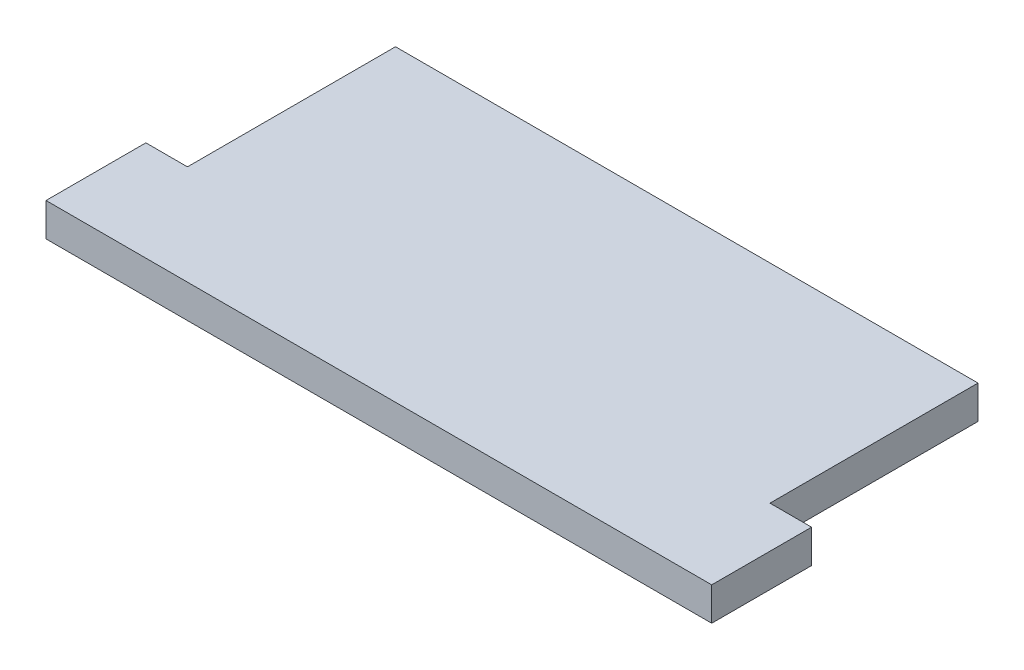
ISO-10303-21;
HEADER;
FILE_DESCRIPTION(('STEP AP214'),'2;1');
FILE_NAME('part.step','',(''),(''),'','','');
FILE_SCHEMA(('AUTOMOTIVE_DESIGN { 1 0 10303 214 1 1 1 1 }'));
ENDSEC;
DATA;
#1=APPLICATION_CONTEXT('core data for automotive mechanical design processes');
#2=APPLICATION_PROTOCOL_DEFINITION('international standard','automotive_design',2000,#1);
#3=PRODUCT_CONTEXT('',#1,'mechanical');
#4=PRODUCT('Part','Part','',(#3));
#5=PRODUCT_RELATED_PRODUCT_CATEGORY('part','',(#4));
#6=PRODUCT_DEFINITION_FORMATION('','',#4);
#7=PRODUCT_DEFINITION_CONTEXT('part definition',#1,'design');
#8=PRODUCT_DEFINITION('design','',#6,#7);
#9=PRODUCT_DEFINITION_SHAPE('','',#8);
#10=(LENGTH_UNIT() NAMED_UNIT(*) SI_UNIT(.MILLI.,.METRE.));
#11=(NAMED_UNIT(*) PLANE_ANGLE_UNIT() SI_UNIT($,.RADIAN.));
#12=(NAMED_UNIT(*) SI_UNIT($,.STERADIAN.) SOLID_ANGLE_UNIT());
#13=UNCERTAINTY_MEASURE_WITH_UNIT(LENGTH_MEASURE(1.E-05),#10,'distance_accuracy_value','');
#14=(GEOMETRIC_REPRESENTATION_CONTEXT(3) GLOBAL_UNCERTAINTY_ASSIGNED_CONTEXT((#13)) GLOBAL_UNIT_ASSIGNED_CONTEXT((#10,
#11,#12)) REPRESENTATION_CONTEXT('',''));
#15=CARTESIAN_POINT('',(0.,0.,0.));
#16=DIRECTION('',(0.,0.,1.));
#17=DIRECTION('',(1.,0.,0.));
#18=AXIS2_PLACEMENT_3D('',#15,#16,#17);
#19=CARTESIAN_POINT('',(0.,2.,-6.));
#20=DIRECTION('',(1.,0.,0.));
#21=DIRECTION('',(0.,0.,-1.));
#22=AXIS2_PLACEMENT_3D('',#19,#20,#21);
#23=PLANE('',#22);
#24=DIRECTION('',(0.,0.,1.));
#25=VECTOR('',#24,1.);
#26=CARTESIAN_POINT('',(0.,0.,-6.));
#27=LINE('',#26,#25);
#28=CARTESIAN_POINT('',(0.,0.,-6.));
#29=VERTEX_POINT('',#28);
#30=CARTESIAN_POINT('',(0.,0.,0.));
#31=VERTEX_POINT('',#30);
#32=EDGE_CURVE('E129',#29,#31,#27,.T.);
#33=ORIENTED_EDGE('',*,*,#32,.T.);
#34=DIRECTION('',(0.,-1.,0.));
#35=VECTOR('',#34,1.);
#36=CARTESIAN_POINT('',(0.,2.,0.));
#37=LINE('',#36,#35);
#38=CARTESIAN_POINT('',(0.,2.,0.));
#39=VERTEX_POINT('',#38);
#40=EDGE_CURVE('E11',#39,#31,#37,.T.);
#41=ORIENTED_EDGE('',*,*,#40,.F.);
#42=DIRECTION('',(0.,0.,1.));
#43=VECTOR('',#42,1.);
#44=CARTESIAN_POINT('',(0.,2.,-6.));
#45=LINE('',#44,#43);
#46=CARTESIAN_POINT('',(0.,2.,-6.));
#47=VERTEX_POINT('',#46);
#48=EDGE_CURVE('E143',#47,#39,#45,.T.);
#49=ORIENTED_EDGE('',*,*,#48,.F.);
#50=DIRECTION('',(0.,-1.,0.));
#51=VECTOR('',#50,1.);
#52=CARTESIAN_POINT('',(0.,2.,-6.));
#53=LINE('',#52,#51);
#54=EDGE_CURVE('E125',#47,#29,#53,.T.);
#55=ORIENTED_EDGE('',*,*,#54,.T.);
#56=EDGE_LOOP('',(#33,#41,#49,#55));
#57=FACE_BOUND('',#56,.T.);
#58=ADVANCED_FACE('F33',(#57),#23,.F.);
#59=CARTESIAN_POINT('',(0.,2.,0.));
#60=DIRECTION('',(0.,0.,-1.));
#61=DIRECTION('',(-1.,0.,0.));
#62=AXIS2_PLACEMENT_3D('',#59,#60,#61);
#63=PLANE('',#62);
#64=DIRECTION('',(1.,0.,0.));
#65=VECTOR('',#64,1.);
#66=CARTESIAN_POINT('',(0.,0.,0.));
#67=LINE('',#66,#65);
#68=CARTESIAN_POINT('',(40.,0.,0.));
#69=VERTEX_POINT('',#68);
#70=EDGE_CURVE('E132',#31,#69,#67,.T.);
#71=ORIENTED_EDGE('',*,*,#70,.T.);
#72=DIRECTION('',(0.,-1.,0.));
#73=VECTOR('',#72,1.);
#74=CARTESIAN_POINT('',(40.,2.,0.));
#75=LINE('',#74,#73);
#76=CARTESIAN_POINT('',(40.,2.,0.));
#77=VERTEX_POINT('',#76);
#78=EDGE_CURVE('E41',#77,#69,#75,.T.);
#79=ORIENTED_EDGE('',*,*,#78,.F.);
#80=DIRECTION('',(1.,0.,0.));
#81=VECTOR('',#80,1.);
#82=CARTESIAN_POINT('',(0.,2.,0.));
#83=LINE('',#82,#81);
#84=EDGE_CURVE('E92',#39,#77,#83,.T.);
#85=ORIENTED_EDGE('',*,*,#84,.F.);
#86=ORIENTED_EDGE('',*,*,#40,.T.);
#87=EDGE_LOOP('',(#71,#79,#85,#86));
#88=FACE_BOUND('',#87,.T.);
#89=ADVANCED_FACE('F178',(#88),#63,.F.);
#90=CARTESIAN_POINT('',(40.,2.,0.));
#91=DIRECTION('',(-1.,0.,0.));
#92=DIRECTION('',(0.,0.,1.));
#93=AXIS2_PLACEMENT_3D('',#90,#91,#92);
#94=PLANE('',#93);
#95=DIRECTION('',(0.,0.,-1.));
#96=VECTOR('',#95,1.);
#97=CARTESIAN_POINT('',(40.,0.,0.));
#98=LINE('',#97,#96);
#99=CARTESIAN_POINT('',(40.,0.,-6.));
#100=VERTEX_POINT('',#99);
#101=EDGE_CURVE('E134',#69,#100,#98,.T.);
#102=ORIENTED_EDGE('',*,*,#101,.T.);
#103=DIRECTION('',(0.,-1.,0.));
#104=VECTOR('',#103,1.);
#105=CARTESIAN_POINT('',(40.,2.,-6.));
#106=LINE('',#105,#104);
#107=CARTESIAN_POINT('',(40.,2.,-6.));
#108=VERTEX_POINT('',#107);
#109=EDGE_CURVE('E150',#108,#100,#106,.T.);
#110=ORIENTED_EDGE('',*,*,#109,.F.);
#111=DIRECTION('',(0.,0.,-1.));
#112=VECTOR('',#111,1.);
#113=CARTESIAN_POINT('',(40.,2.,0.));
#114=LINE('',#113,#112);
#115=EDGE_CURVE('E158',#77,#108,#114,.T.);
#116=ORIENTED_EDGE('',*,*,#115,.F.);
#117=ORIENTED_EDGE('',*,*,#78,.T.);
#118=EDGE_LOOP('',(#102,#110,#116,#117));
#119=FACE_BOUND('',#118,.T.);
#120=ADVANCED_FACE('F156',(#119),#94,.F.);
#121=CARTESIAN_POINT('',(40.,2.,-6.));
#122=DIRECTION('',(0.,0.,1.));
#123=DIRECTION('',(1.,0.,0.));
#124=AXIS2_PLACEMENT_3D('',#121,#122,#123);
#125=PLANE('',#124);
#126=DIRECTION('',(-1.,0.,0.));
#127=VECTOR('',#126,1.);
#128=CARTESIAN_POINT('',(40.,0.,-6.));
#129=LINE('',#128,#127);
#130=CARTESIAN_POINT('',(37.5,0.,-6.));
#131=VERTEX_POINT('',#130);
#132=EDGE_CURVE('E136',#100,#131,#129,.T.);
#133=ORIENTED_EDGE('',*,*,#132,.T.);
#134=DIRECTION('',(0.,-1.,0.));
#135=VECTOR('',#134,1.);
#136=CARTESIAN_POINT('',(37.5,2.,-6.));
#137=LINE('',#136,#135);
#138=CARTESIAN_POINT('',(37.5,2.,-6.));
#139=VERTEX_POINT('',#138);
#140=EDGE_CURVE('E147',#139,#131,#137,.T.);
#141=ORIENTED_EDGE('',*,*,#140,.F.);
#142=DIRECTION('',(-1.,0.,0.));
#143=VECTOR('',#142,1.);
#144=CARTESIAN_POINT('',(40.,2.,-6.));
#145=LINE('',#144,#143);
#146=EDGE_CURVE('E170',#108,#139,#145,.T.);
#147=ORIENTED_EDGE('',*,*,#146,.F.);
#148=ORIENTED_EDGE('',*,*,#109,.T.);
#149=EDGE_LOOP('',(#133,#141,#147,#148));
#150=FACE_BOUND('',#149,.T.);
#151=ADVANCED_FACE('F166',(#150),#125,.F.);
#152=CARTESIAN_POINT('',(37.5,2.,-6.));
#153=DIRECTION('',(-1.,0.,0.));
#154=DIRECTION('',(0.,0.,1.));
#155=AXIS2_PLACEMENT_3D('',#152,#153,#154);
#156=PLANE('',#155);
#157=DIRECTION('',(0.,0.,-1.));
#158=VECTOR('',#157,1.);
#159=CARTESIAN_POINT('',(37.5,0.,-6.));
#160=LINE('',#159,#158);
#161=CARTESIAN_POINT('',(37.5,0.,-18.5));
#162=VERTEX_POINT('',#161);
#163=EDGE_CURVE('E138',#131,#162,#160,.T.);
#164=ORIENTED_EDGE('',*,*,#163,.T.);
#165=DIRECTION('',(0.,-1.,0.));
#166=VECTOR('',#165,1.);
#167=CARTESIAN_POINT('',(37.5,2.,-18.5));
#168=LINE('',#167,#166);
#169=CARTESIAN_POINT('',(37.5,2.,-18.5));
#170=VERTEX_POINT('',#169);
#171=EDGE_CURVE('E120',#170,#162,#168,.T.);
#172=ORIENTED_EDGE('',*,*,#171,.F.);
#173=DIRECTION('',(0.,0.,-1.));
#174=VECTOR('',#173,1.);
#175=CARTESIAN_POINT('',(37.5,2.,-6.));
#176=LINE('',#175,#174);
#177=EDGE_CURVE('E111',#139,#170,#176,.T.);
#178=ORIENTED_EDGE('',*,*,#177,.F.);
#179=ORIENTED_EDGE('',*,*,#140,.T.);
#180=EDGE_LOOP('',(#164,#172,#178,#179));
#181=FACE_BOUND('',#180,.T.);
#182=ADVANCED_FACE('F169',(#181),#156,.F.);
#183=CARTESIAN_POINT('',(37.5,2.,-18.5));
#184=DIRECTION('',(0.,0.,1.));
#185=DIRECTION('',(1.,0.,0.));
#186=AXIS2_PLACEMENT_3D('',#183,#184,#185);
#187=PLANE('',#186);
#188=DIRECTION('',(-1.,0.,0.));
#189=VECTOR('',#188,1.);
#190=CARTESIAN_POINT('',(37.5,0.,-18.5));
#191=LINE('',#190,#189);
#192=CARTESIAN_POINT('',(2.5,0.,-18.5));
#193=VERTEX_POINT('',#192);
#194=EDGE_CURVE('E119',#162,#193,#191,.T.);
#195=ORIENTED_EDGE('',*,*,#194,.T.);
#196=DIRECTION('',(0.,-1.,0.));
#197=VECTOR('',#196,1.);
#198=CARTESIAN_POINT('',(2.5,2.,-18.5));
#199=LINE('',#198,#197);
#200=CARTESIAN_POINT('',(2.5,2.,-18.5));
#201=VERTEX_POINT('',#200);
#202=EDGE_CURVE('E116',#201,#193,#199,.T.);
#203=ORIENTED_EDGE('',*,*,#202,.F.);
#204=DIRECTION('',(-1.,0.,0.));
#205=VECTOR('',#204,1.);
#206=CARTESIAN_POINT('',(37.5,2.,-18.5));
#207=LINE('',#206,#205);
#208=EDGE_CURVE('E105',#170,#201,#207,.T.);
#209=ORIENTED_EDGE('',*,*,#208,.F.);
#210=ORIENTED_EDGE('',*,*,#171,.T.);
#211=EDGE_LOOP('',(#195,#203,#209,#210));
#212=FACE_BOUND('',#211,.T.);
#213=ADVANCED_FACE('F117',(#212),#187,.F.);
#214=CARTESIAN_POINT('',(2.5,2.,-18.5));
#215=DIRECTION('',(1.,0.,0.));
#216=DIRECTION('',(0.,0.,-1.));
#217=AXIS2_PLACEMENT_3D('',#214,#215,#216);
#218=PLANE('',#217);
#219=DIRECTION('',(0.,0.,1.));
#220=VECTOR('',#219,1.);
#221=CARTESIAN_POINT('',(2.5,0.,-18.5));
#222=LINE('',#221,#220);
#223=CARTESIAN_POINT('',(2.5,0.,-6.));
#224=VERTEX_POINT('',#223);
#225=EDGE_CURVE('E78',#193,#224,#222,.T.);
#226=ORIENTED_EDGE('',*,*,#225,.T.);
#227=DIRECTION('',(0.,-1.,0.));
#228=VECTOR('',#227,1.);
#229=CARTESIAN_POINT('',(2.5,2.,-6.));
#230=LINE('',#229,#228);
#231=CARTESIAN_POINT('',(2.5,2.,-6.));
#232=VERTEX_POINT('',#231);
#233=EDGE_CURVE('E121',#232,#224,#230,.T.);
#234=ORIENTED_EDGE('',*,*,#233,.F.);
#235=DIRECTION('',(0.,0.,1.));
#236=VECTOR('',#235,1.);
#237=CARTESIAN_POINT('',(2.5,2.,-18.5));
#238=LINE('',#237,#236);
#239=EDGE_CURVE('E109',#201,#232,#238,.T.);
#240=ORIENTED_EDGE('',*,*,#239,.F.);
#241=ORIENTED_EDGE('',*,*,#202,.T.);
#242=EDGE_LOOP('',(#226,#234,#240,#241));
#243=FACE_BOUND('',#242,.T.);
#244=ADVANCED_FACE('F123',(#243),#218,.F.);
#245=CARTESIAN_POINT('',(2.5,2.,-6.));
#246=DIRECTION('',(0.,0.,1.));
#247=DIRECTION('',(1.,0.,0.));
#248=AXIS2_PLACEMENT_3D('',#245,#246,#247);
#249=PLANE('',#248);
#250=DIRECTION('',(-1.,0.,0.));
#251=VECTOR('',#250,1.);
#252=CARTESIAN_POINT('',(2.5,0.,-6.));
#253=LINE('',#252,#251);
#254=EDGE_CURVE('E84',#224,#29,#253,.T.);
#255=ORIENTED_EDGE('',*,*,#254,.T.);
#256=ORIENTED_EDGE('',*,*,#54,.F.);
#257=DIRECTION('',(-1.,0.,0.));
#258=VECTOR('',#257,1.);
#259=CARTESIAN_POINT('',(2.5,2.,-6.));
#260=LINE('',#259,#258);
#261=EDGE_CURVE('E49',#232,#47,#260,.T.);
#262=ORIENTED_EDGE('',*,*,#261,.F.);
#263=ORIENTED_EDGE('',*,*,#233,.T.);
#264=EDGE_LOOP('',(#255,#256,#262,#263));
#265=FACE_BOUND('',#264,.T.);
#266=ADVANCED_FACE('F194',(#265),#249,.F.);
#267=CARTESIAN_POINT('',(0.,2.,0.));
#268=DIRECTION('',(0.,1.,0.));
#269=DIRECTION('',(0.,0.,1.));
#270=AXIS2_PLACEMENT_3D('',#267,#268,#269);
#271=PLANE('',#270);
#272=ORIENTED_EDGE('',*,*,#48,.T.);
#273=ORIENTED_EDGE('',*,*,#84,.T.);
#274=ORIENTED_EDGE('',*,*,#115,.T.);
#275=ORIENTED_EDGE('',*,*,#146,.T.);
#276=ORIENTED_EDGE('',*,*,#177,.T.);
#277=ORIENTED_EDGE('',*,*,#208,.T.);
#278=ORIENTED_EDGE('',*,*,#239,.T.);
#279=ORIENTED_EDGE('',*,*,#261,.T.);
#280=EDGE_LOOP('',(#272,#273,#274,#275,#276,#277,#278,#279));
#281=FACE_BOUND('',#280,.T.);
#282=ADVANCED_FACE('F107',(#281),#271,.T.);
#283=CARTESIAN_POINT('',(0.,0.,0.));
#284=DIRECTION('',(0.,1.,0.));
#285=DIRECTION('',(0.,0.,1.));
#286=AXIS2_PLACEMENT_3D('',#283,#284,#285);
#287=PLANE('',#286);
#288=ORIENTED_EDGE('',*,*,#32,.F.);
#289=ORIENTED_EDGE('',*,*,#254,.F.);
#290=ORIENTED_EDGE('',*,*,#225,.F.);
#291=ORIENTED_EDGE('',*,*,#194,.F.);
#292=ORIENTED_EDGE('',*,*,#163,.F.);
#293=ORIENTED_EDGE('',*,*,#132,.F.);
#294=ORIENTED_EDGE('',*,*,#101,.F.);
#295=ORIENTED_EDGE('',*,*,#70,.F.);
#296=EDGE_LOOP('',(#288,#289,#290,#291,#292,#293,#294,#295));
#297=FACE_BOUND('',#296,.T.);
#298=ADVANCED_FACE('F162',(#297),#287,.F.);
#299=CLOSED_SHELL('',(#58,#89,#120,#151,#182,#213,#244,#266,#282,#298));
#300=MANIFOLD_SOLID_BREP('B2',#299);
#301=ADVANCED_BREP_SHAPE_REPRESENTATION('',(#18,#300),#14);
#302=SHAPE_DEFINITION_REPRESENTATION(#9,#301);
ENDSEC;
END-ISO-10303-21;
